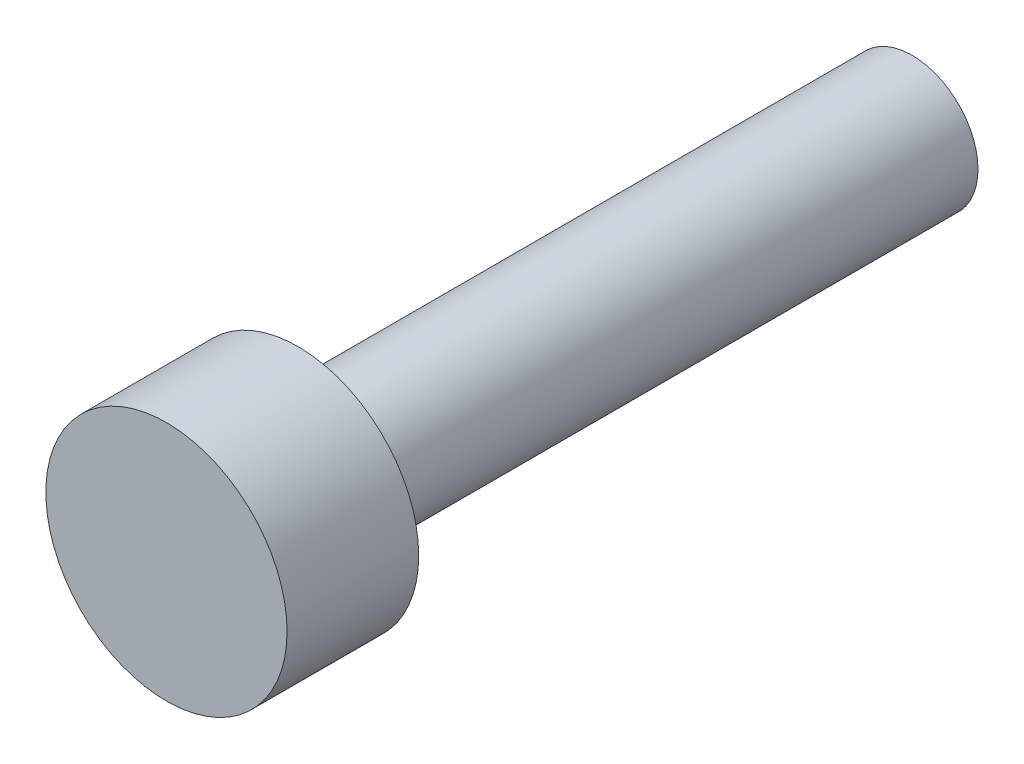
ISO-10303-21;
HEADER;
FILE_DESCRIPTION(('STEP AP214'),'2;1');
FILE_NAME('part.step','',(''),(''),'','','');
FILE_SCHEMA(('AUTOMOTIVE_DESIGN { 1 0 10303 214 1 1 1 1 }'));
ENDSEC;
DATA;
#1=APPLICATION_CONTEXT('core data for automotive mechanical design processes');
#2=APPLICATION_PROTOCOL_DEFINITION('international standard','automotive_design',2000,#1);
#3=PRODUCT_CONTEXT('',#1,'mechanical');
#4=PRODUCT('Part','Part','',(#3));
#5=PRODUCT_RELATED_PRODUCT_CATEGORY('part','',(#4));
#6=PRODUCT_DEFINITION_FORMATION('','',#4);
#7=PRODUCT_DEFINITION_CONTEXT('part definition',#1,'design');
#8=PRODUCT_DEFINITION('design','',#6,#7);
#9=PRODUCT_DEFINITION_SHAPE('','',#8);
#10=(LENGTH_UNIT() NAMED_UNIT(*) SI_UNIT(.MILLI.,.METRE.));
#11=(NAMED_UNIT(*) PLANE_ANGLE_UNIT() SI_UNIT($,.RADIAN.));
#12=(NAMED_UNIT(*) SI_UNIT($,.STERADIAN.) SOLID_ANGLE_UNIT());
#13=UNCERTAINTY_MEASURE_WITH_UNIT(LENGTH_MEASURE(1.E-05),#10,'distance_accuracy_value','');
#14=(GEOMETRIC_REPRESENTATION_CONTEXT(3) GLOBAL_UNCERTAINTY_ASSIGNED_CONTEXT((#13)) GLOBAL_UNIT_ASSIGNED_CONTEXT((#10,
#11,#12)) REPRESENTATION_CONTEXT('',''));
#15=CARTESIAN_POINT('',(0.,0.,0.));
#16=DIRECTION('',(0.,0.,1.));
#17=DIRECTION('',(1.,0.,0.));
#18=AXIS2_PLACEMENT_3D('',#15,#16,#17);
#19=CARTESIAN_POINT('',(0.,0.,14.));
#20=DIRECTION('',(0.,0.,-1.));
#21=DIRECTION('',(-1.,0.,0.));
#22=AXIS2_PLACEMENT_3D('',#19,#20,#21);
#23=CYLINDRICAL_SURFACE('',#22,1.5);
#24=CARTESIAN_POINT('',(0.,0.,14.));
#25=DIRECTION('',(0.,0.,1.));
#26=DIRECTION('',(1.,0.,0.));
#27=AXIS2_PLACEMENT_3D('',#24,#25,#26);
#28=CIRCLE('',#27,1.5);
#29=CARTESIAN_POINT('',(1.5,0.,14.));
#30=VERTEX_POINT('',#29);
#31=EDGE_CURVE('E10',#30,#30,#28,.T.);
#32=ORIENTED_EDGE('',*,*,#31,.F.);
#33=EDGE_LOOP('',(#32));
#34=FACE_BOUND('',#33,.T.);
#35=CARTESIAN_POINT('',(0.,0.,0.));
#36=DIRECTION('',(0.,0.,1.));
#37=DIRECTION('',(1.,0.,0.));
#38=AXIS2_PLACEMENT_3D('',#35,#36,#37);
#39=CIRCLE('',#38,1.5);
#40=CARTESIAN_POINT('',(1.5,0.,0.));
#41=VERTEX_POINT('',#40);
#42=EDGE_CURVE('E40',#41,#41,#39,.T.);
#43=ORIENTED_EDGE('',*,*,#42,.T.);
#44=EDGE_LOOP('',(#43));
#45=FACE_BOUND('',#44,.T.);
#46=ADVANCED_FACE('F37',(#34,#45),#23,.T.);
#47=CARTESIAN_POINT('',(0.,0.,0.));
#48=DIRECTION('',(0.,0.,1.));
#49=DIRECTION('',(1.,0.,0.));
#50=AXIS2_PLACEMENT_3D('',#47,#48,#49);
#51=PLANE('',#50);
#52=ORIENTED_EDGE('',*,*,#42,.F.);
#53=EDGE_LOOP('',(#52));
#54=FACE_BOUND('',#53,.T.);
#55=ADVANCED_FACE('F60',(#54),#51,.F.);
#56=CARTESIAN_POINT('',(0.,0.,17.));
#57=DIRECTION('',(0.,0.,-1.));
#58=DIRECTION('',(-1.,0.,0.));
#59=AXIS2_PLACEMENT_3D('',#56,#57,#58);
#60=CYLINDRICAL_SURFACE('',#59,2.75);
#61=CARTESIAN_POINT('',(0.,0.,17.));
#62=DIRECTION('',(0.,0.,1.));
#63=DIRECTION('',(1.,0.,0.));
#64=AXIS2_PLACEMENT_3D('',#61,#62,#63);
#65=CIRCLE('',#64,2.75);
#66=CARTESIAN_POINT('',(2.75,0.,17.));
#67=VERTEX_POINT('',#66);
#68=EDGE_CURVE('E47',#67,#67,#65,.T.);
#69=ORIENTED_EDGE('',*,*,#68,.F.);
#70=EDGE_LOOP('',(#69));
#71=FACE_BOUND('',#70,.T.);
#72=CARTESIAN_POINT('',(0.,0.,14.));
#73=DIRECTION('',(0.,0.,1.));
#74=DIRECTION('',(1.,0.,0.));
#75=AXIS2_PLACEMENT_3D('',#72,#73,#74);
#76=CIRCLE('',#75,2.75);
#77=CARTESIAN_POINT('',(2.75,0.,14.));
#78=VERTEX_POINT('',#77);
#79=EDGE_CURVE('E49',#78,#78,#76,.T.);
#80=ORIENTED_EDGE('',*,*,#79,.T.);
#81=EDGE_LOOP('',(#80));
#82=FACE_BOUND('',#81,.T.);
#83=ADVANCED_FACE('F57',(#71,#82),#60,.T.);
#84=CARTESIAN_POINT('',(0.,0.,17.));
#85=DIRECTION('',(0.,0.,1.));
#86=DIRECTION('',(1.,0.,0.));
#87=AXIS2_PLACEMENT_3D('',#84,#85,#86);
#88=PLANE('',#87);
#89=ORIENTED_EDGE('',*,*,#68,.T.);
#90=EDGE_LOOP('',(#89));
#91=FACE_BOUND('',#90,.T.);
#92=ADVANCED_FACE('F55',(#91),#88,.T.);
#93=CARTESIAN_POINT('',(0.,0.,14.));
#94=DIRECTION('',(0.,0.,1.));
#95=DIRECTION('',(1.,0.,0.));
#96=AXIS2_PLACEMENT_3D('',#93,#94,#95);
#97=PLANE('',#96);
#98=ORIENTED_EDGE('',*,*,#31,.T.);
#99=EDGE_LOOP('',(#98));
#100=FACE_BOUND('',#99,.T.);
#101=ORIENTED_EDGE('',*,*,#79,.F.);
#102=EDGE_LOOP('',(#101));
#103=FACE_BOUND('',#102,.T.);
#104=ADVANCED_FACE('F64',(#100,#103),#97,.F.);
#105=CLOSED_SHELL('',(#46,#55,#83,#92,#104));
#106=MANIFOLD_SOLID_BREP('B2',#105);
#107=ADVANCED_BREP_SHAPE_REPRESENTATION('',(#18,#106),#14);
#108=SHAPE_DEFINITION_REPRESENTATION(#9,#107);
ENDSEC;
END-ISO-10303-21;
